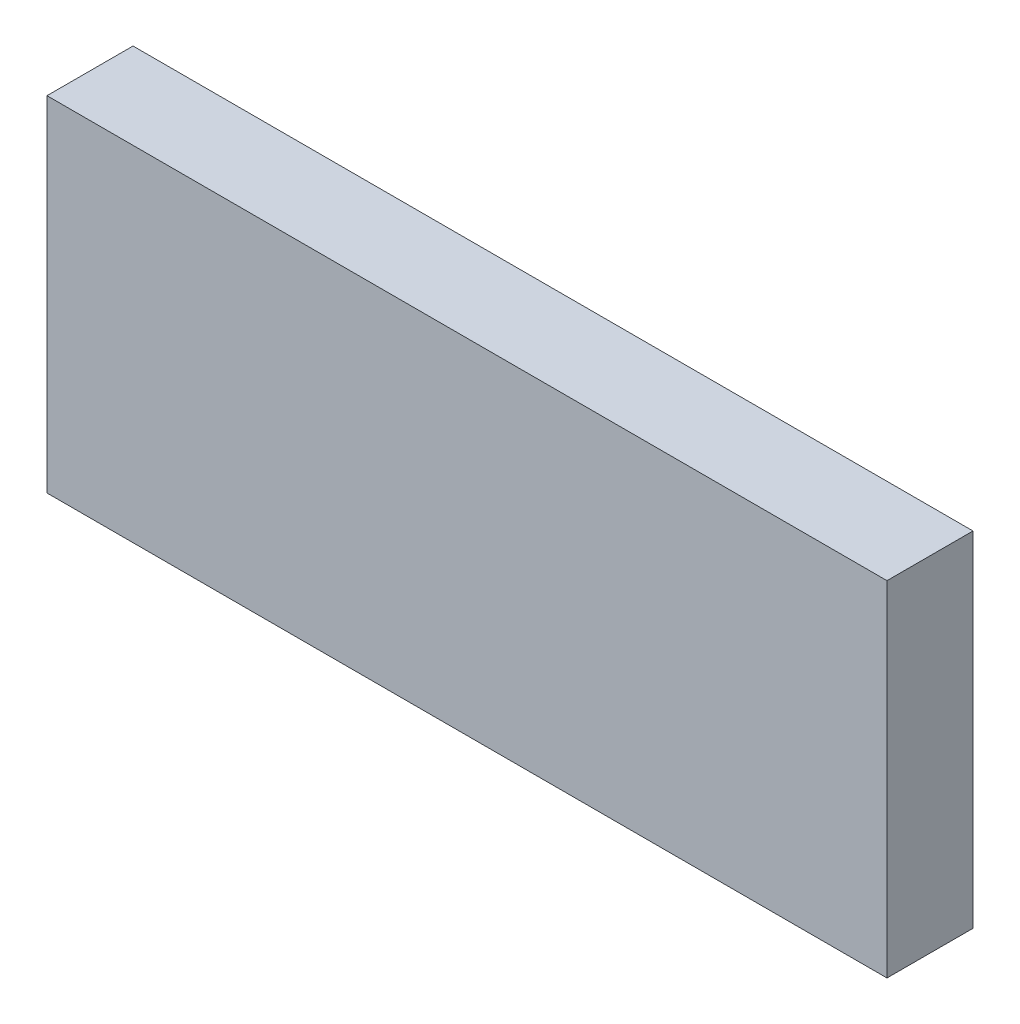
ISO-10303-21;
HEADER;
FILE_DESCRIPTION(('STEP AP214'),'2;1');
FILE_NAME('part.step','',(''),(''),'','','');
FILE_SCHEMA(('AUTOMOTIVE_DESIGN { 1 0 10303 214 1 1 1 1 }'));
ENDSEC;
DATA;
#1=APPLICATION_CONTEXT('core data for automotive mechanical design processes');
#2=APPLICATION_PROTOCOL_DEFINITION('international standard','automotive_design',2000,#1);
#3=PRODUCT_CONTEXT('',#1,'mechanical');
#4=PRODUCT('Part','Part','',(#3));
#5=PRODUCT_RELATED_PRODUCT_CATEGORY('part','',(#4));
#6=PRODUCT_DEFINITION_FORMATION('','',#4);
#7=PRODUCT_DEFINITION_CONTEXT('part definition',#1,'design');
#8=PRODUCT_DEFINITION('design','',#6,#7);
#9=PRODUCT_DEFINITION_SHAPE('','',#8);
#10=(LENGTH_UNIT() NAMED_UNIT(*) SI_UNIT(.MILLI.,.METRE.));
#11=(NAMED_UNIT(*) PLANE_ANGLE_UNIT() SI_UNIT($,.RADIAN.));
#12=(NAMED_UNIT(*) SI_UNIT($,.STERADIAN.) SOLID_ANGLE_UNIT());
#13=UNCERTAINTY_MEASURE_WITH_UNIT(LENGTH_MEASURE(1.E-05),#10,'distance_accuracy_value','');
#14=(GEOMETRIC_REPRESENTATION_CONTEXT(3) GLOBAL_UNCERTAINTY_ASSIGNED_CONTEXT((#13)) GLOBAL_UNIT_ASSIGNED_CONTEXT((#10,
#11,#12)) REPRESENTATION_CONTEXT('',''));
#15=CARTESIAN_POINT('',(0.,0.,0.));
#16=DIRECTION('',(0.,0.,1.));
#17=DIRECTION('',(1.,0.,0.));
#18=AXIS2_PLACEMENT_3D('',#15,#16,#17);
#19=CARTESIAN_POINT('',(0.,0.,6.35));
#20=DIRECTION('',(1.,0.,0.));
#21=DIRECTION('',(0.,0.,-1.));
#22=AXIS2_PLACEMENT_3D('',#19,#20,#21);
#23=PLANE('',#22);
#24=DIRECTION('',(0.,-1.,0.));
#25=VECTOR('',#24,1.);
#26=CARTESIAN_POINT('',(0.,0.,0.));
#27=LINE('',#26,#25);
#28=CARTESIAN_POINT('',(0.,25.4,0.));
#29=VERTEX_POINT('',#28);
#30=CARTESIAN_POINT('',(0.,0.,0.));
#31=VERTEX_POINT('',#30);
#32=EDGE_CURVE('E99',#29,#31,#27,.T.);
#33=ORIENTED_EDGE('',*,*,#32,.T.);
#34=DIRECTION('',(0.,0.,-1.));
#35=VECTOR('',#34,1.);
#36=CARTESIAN_POINT('',(0.,0.,6.35));
#37=LINE('',#36,#35);
#38=CARTESIAN_POINT('',(0.,0.,6.35));
#39=VERTEX_POINT('',#38);
#40=EDGE_CURVE('E11',#39,#31,#37,.T.);
#41=ORIENTED_EDGE('',*,*,#40,.F.);
#42=DIRECTION('',(0.,-1.,0.));
#43=VECTOR('',#42,1.);
#44=CARTESIAN_POINT('',(0.,0.,6.35));
#45=LINE('',#44,#43);
#46=CARTESIAN_POINT('',(0.,25.4,6.35));
#47=VERTEX_POINT('',#46);
#48=EDGE_CURVE('E87',#47,#39,#45,.T.);
#49=ORIENTED_EDGE('',*,*,#48,.F.);
#50=DIRECTION('',(0.,0.,-1.));
#51=VECTOR('',#50,1.);
#52=CARTESIAN_POINT('',(0.,25.4,6.35));
#53=LINE('',#52,#51);
#54=EDGE_CURVE('E95',#47,#29,#53,.T.);
#55=ORIENTED_EDGE('',*,*,#54,.T.);
#56=EDGE_LOOP('',(#33,#41,#49,#55));
#57=FACE_BOUND('',#56,.T.);
#58=ADVANCED_FACE('F36',(#57),#23,.F.);
#59=CARTESIAN_POINT('',(0.,0.,6.35));
#60=DIRECTION('',(0.,1.,0.));
#61=DIRECTION('',(0.,0.,1.));
#62=AXIS2_PLACEMENT_3D('',#59,#60,#61);
#63=PLANE('',#62);
#64=DIRECTION('',(1.,0.,0.));
#65=VECTOR('',#64,1.);
#66=CARTESIAN_POINT('',(0.,0.,0.));
#67=LINE('',#66,#65);
#68=CARTESIAN_POINT('',(62.,0.,0.));
#69=VERTEX_POINT('',#68);
#70=EDGE_CURVE('E91',#31,#69,#67,.T.);
#71=ORIENTED_EDGE('',*,*,#70,.T.);
#72=DIRECTION('',(0.,0.,-1.));
#73=VECTOR('',#72,1.);
#74=CARTESIAN_POINT('',(62.,0.,6.35));
#75=LINE('',#74,#73);
#76=CARTESIAN_POINT('',(62.,0.,6.35));
#77=VERTEX_POINT('',#76);
#78=EDGE_CURVE('E44',#77,#69,#75,.T.);
#79=ORIENTED_EDGE('',*,*,#78,.F.);
#80=DIRECTION('',(1.,0.,0.));
#81=VECTOR('',#80,1.);
#82=CARTESIAN_POINT('',(0.,0.,6.35));
#83=LINE('',#82,#81);
#84=EDGE_CURVE('E82',#39,#77,#83,.T.);
#85=ORIENTED_EDGE('',*,*,#84,.F.);
#86=ORIENTED_EDGE('',*,*,#40,.T.);
#87=EDGE_LOOP('',(#71,#79,#85,#86));
#88=FACE_BOUND('',#87,.T.);
#89=ADVANCED_FACE('F90',(#88),#63,.F.);
#90=CARTESIAN_POINT('',(62.,0.,6.35));
#91=DIRECTION('',(-1.,0.,0.));
#92=DIRECTION('',(0.,0.,1.));
#93=AXIS2_PLACEMENT_3D('',#90,#91,#92);
#94=PLANE('',#93);
#95=DIRECTION('',(0.,1.,0.));
#96=VECTOR('',#95,1.);
#97=CARTESIAN_POINT('',(62.,0.,0.));
#98=LINE('',#97,#96);
#99=CARTESIAN_POINT('',(62.,25.4,0.));
#100=VERTEX_POINT('',#99);
#101=EDGE_CURVE('E69',#69,#100,#98,.T.);
#102=ORIENTED_EDGE('',*,*,#101,.T.);
#103=DIRECTION('',(0.,0.,-1.));
#104=VECTOR('',#103,1.);
#105=CARTESIAN_POINT('',(62.,25.4,6.35));
#106=LINE('',#105,#104);
#107=CARTESIAN_POINT('',(62.,25.4,6.35));
#108=VERTEX_POINT('',#107);
#109=EDGE_CURVE('E92',#108,#100,#106,.T.);
#110=ORIENTED_EDGE('',*,*,#109,.F.);
#111=DIRECTION('',(0.,1.,0.));
#112=VECTOR('',#111,1.);
#113=CARTESIAN_POINT('',(62.,0.,6.35));
#114=LINE('',#113,#112);
#115=EDGE_CURVE('E85',#77,#108,#114,.T.);
#116=ORIENTED_EDGE('',*,*,#115,.F.);
#117=ORIENTED_EDGE('',*,*,#78,.T.);
#118=EDGE_LOOP('',(#102,#110,#116,#117));
#119=FACE_BOUND('',#118,.T.);
#120=ADVANCED_FACE('F93',(#119),#94,.F.);
#121=CARTESIAN_POINT('',(0.,25.4,6.35));
#122=DIRECTION('',(0.,-1.,0.));
#123=DIRECTION('',(0.,0.,-1.));
#124=AXIS2_PLACEMENT_3D('',#121,#122,#123);
#125=PLANE('',#124);
#126=DIRECTION('',(-1.,0.,0.));
#127=VECTOR('',#126,1.);
#128=CARTESIAN_POINT('',(0.,25.4,0.));
#129=LINE('',#128,#127);
#130=EDGE_CURVE('E75',#100,#29,#129,.T.);
#131=ORIENTED_EDGE('',*,*,#130,.T.);
#132=ORIENTED_EDGE('',*,*,#54,.F.);
#133=DIRECTION('',(-1.,0.,0.));
#134=VECTOR('',#133,1.);
#135=CARTESIAN_POINT('',(0.,25.4,6.35));
#136=LINE('',#135,#134);
#137=EDGE_CURVE('E52',#108,#47,#136,.T.);
#138=ORIENTED_EDGE('',*,*,#137,.F.);
#139=ORIENTED_EDGE('',*,*,#109,.T.);
#140=EDGE_LOOP('',(#131,#132,#138,#139));
#141=FACE_BOUND('',#140,.T.);
#142=ADVANCED_FACE('F106',(#141),#125,.F.);
#143=CARTESIAN_POINT('',(0.,0.,6.35));
#144=DIRECTION('',(0.,0.,-1.));
#145=DIRECTION('',(-1.,0.,0.));
#146=AXIS2_PLACEMENT_3D('',#143,#144,#145);
#147=PLANE('',#146);
#148=ORIENTED_EDGE('',*,*,#48,.T.);
#149=ORIENTED_EDGE('',*,*,#84,.T.);
#150=ORIENTED_EDGE('',*,*,#115,.T.);
#151=ORIENTED_EDGE('',*,*,#137,.T.);
#152=EDGE_LOOP('',(#148,#149,#150,#151));
#153=FACE_BOUND('',#152,.T.);
#154=ADVANCED_FACE('F83',(#153),#147,.F.);
#155=CARTESIAN_POINT('',(0.,0.,0.));
#156=DIRECTION('',(0.,0.,-1.));
#157=DIRECTION('',(-1.,0.,0.));
#158=AXIS2_PLACEMENT_3D('',#155,#156,#157);
#159=PLANE('',#158);
#160=ORIENTED_EDGE('',*,*,#32,.F.);
#161=ORIENTED_EDGE('',*,*,#130,.F.);
#162=ORIENTED_EDGE('',*,*,#101,.F.);
#163=ORIENTED_EDGE('',*,*,#70,.F.);
#164=EDGE_LOOP('',(#160,#161,#162,#163));
#165=FACE_BOUND('',#164,.T.);
#166=ADVANCED_FACE('F109',(#165),#159,.T.);
#167=CLOSED_SHELL('',(#58,#89,#120,#142,#154,#166));
#168=MANIFOLD_SOLID_BREP('B2',#167);
#169=ADVANCED_BREP_SHAPE_REPRESENTATION('',(#18,#168),#14);
#170=SHAPE_DEFINITION_REPRESENTATION(#9,#169);
ENDSEC;
END-ISO-10303-21;
